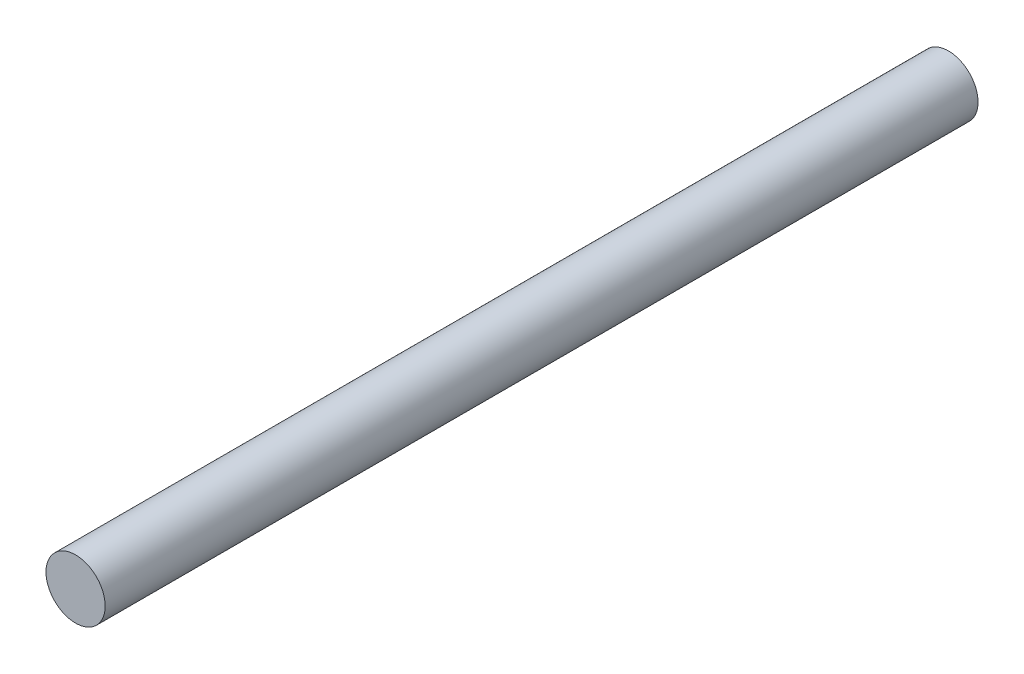
ISO-10303-21;
HEADER;
FILE_DESCRIPTION(('STEP AP214'),'2;1');
FILE_NAME('part.step','',(''),(''),'','','');
FILE_SCHEMA(('AUTOMOTIVE_DESIGN { 1 0 10303 214 1 1 1 1 }'));
ENDSEC;
DATA;
#1=APPLICATION_CONTEXT('core data for automotive mechanical design processes');
#2=APPLICATION_PROTOCOL_DEFINITION('international standard','automotive_design',2000,#1);
#3=PRODUCT_CONTEXT('',#1,'mechanical');
#4=PRODUCT('Part','Part','',(#3));
#5=PRODUCT_RELATED_PRODUCT_CATEGORY('part','',(#4));
#6=PRODUCT_DEFINITION_FORMATION('','',#4);
#7=PRODUCT_DEFINITION_CONTEXT('part definition',#1,'design');
#8=PRODUCT_DEFINITION('design','',#6,#7);
#9=PRODUCT_DEFINITION_SHAPE('','',#8);
#10=(LENGTH_UNIT() NAMED_UNIT(*) SI_UNIT(.MILLI.,.METRE.));
#11=(NAMED_UNIT(*) PLANE_ANGLE_UNIT() SI_UNIT($,.RADIAN.));
#12=(NAMED_UNIT(*) SI_UNIT($,.STERADIAN.) SOLID_ANGLE_UNIT());
#13=UNCERTAINTY_MEASURE_WITH_UNIT(LENGTH_MEASURE(1.E-05),#10,'distance_accuracy_value','');
#14=(GEOMETRIC_REPRESENTATION_CONTEXT(3) GLOBAL_UNCERTAINTY_ASSIGNED_CONTEXT((#13)) GLOBAL_UNIT_ASSIGNED_CONTEXT((#10,
#11,#12)) REPRESENTATION_CONTEXT('',''));
#15=CARTESIAN_POINT('',(0.,0.,0.));
#16=DIRECTION('',(0.,0.,1.));
#17=DIRECTION('',(1.,0.,0.));
#18=AXIS2_PLACEMENT_3D('',#15,#16,#17);
#19=CARTESIAN_POINT('',(-25.2692554848573,4.15645087916714,59.));
#20=DIRECTION('',(0.,0.,-1.));
#21=DIRECTION('',(-1.,0.,0.));
#22=AXIS2_PLACEMENT_3D('',#19,#20,#21);
#23=CYLINDRICAL_SURFACE('',#22,2.);
#24=CARTESIAN_POINT('',(-25.2692554848573,4.15645087916714,59.));
#25=DIRECTION('',(0.,0.,1.));
#26=DIRECTION('',(1.,0.,0.));
#27=AXIS2_PLACEMENT_3D('',#24,#25,#26);
#28=CIRCLE('',#27,2.);
#29=CARTESIAN_POINT('',(-27.2692554848573,4.15645087916714,59.));
#30=VERTEX_POINT('',#29);
#31=EDGE_CURVE('E10',#30,#30,#28,.T.);
#32=CARTESIAN_POINT('',(-25.2692554848573,4.15645087916714,0.));
#33=DIRECTION('',(0.,0.,1.));
#34=DIRECTION('',(1.,0.,0.));
#35=AXIS2_PLACEMENT_3D('',#32,#33,#34);
#36=CIRCLE('',#35,2.);
#37=CARTESIAN_POINT('',(-27.2692554848573,4.15645087916714,0.));
#38=VERTEX_POINT('',#37);
#39=EDGE_CURVE('E34',#38,#38,#36,.T.);
#40=CARTESIAN_POINT('',(-27.2692554848573,4.15645087916714,59.));
#41=CARTESIAN_POINT('',(-27.2692554848573,4.15645087916714,58.3854166666667));
#42=CARTESIAN_POINT('',(-27.2692554848573,4.15645087916714,57.7708333333333));
#43=CARTESIAN_POINT('',(-27.2692554848573,4.15645087916714,56.5416666666667));
#44=CARTESIAN_POINT('',(-27.2692554848573,4.15645087916714,55.9270833333333));
#45=CARTESIAN_POINT('',(-27.2692554848573,4.15645087916714,54.6979166666667));
#46=CARTESIAN_POINT('',(-27.2692554848573,4.15645087916714,54.0833333333333));
#47=CARTESIAN_POINT('',(-27.2692554848573,4.15645087916714,52.8541666666667));
#48=CARTESIAN_POINT('',(-27.2692554848573,4.15645087916714,52.2395833333333));
#49=CARTESIAN_POINT('',(-27.2692554848573,4.15645087916714,51.0104166666667));
#50=CARTESIAN_POINT('',(-27.2692554848573,4.15645087916714,50.3958333333333));
#51=CARTESIAN_POINT('',(-27.2692554848573,4.15645087916714,49.1666666666667));
#52=CARTESIAN_POINT('',(-27.2692554848573,4.15645087916714,48.5520833333333));
#53=CARTESIAN_POINT('',(-27.2692554848573,4.15645087916714,47.3229166666667));
#54=CARTESIAN_POINT('',(-27.2692554848573,4.15645087916714,46.7083333333333));
#55=CARTESIAN_POINT('',(-27.2692554848573,4.15645087916714,45.4791666666667));
#56=CARTESIAN_POINT('',(-27.2692554848573,4.15645087916714,44.8645833333333));
#57=CARTESIAN_POINT('',(-27.2692554848573,4.15645087916714,43.6354166666667));
#58=CARTESIAN_POINT('',(-27.2692554848573,4.15645087916714,43.0208333333333));
#59=CARTESIAN_POINT('',(-27.2692554848573,4.15645087916714,41.7916666666667));
#60=CARTESIAN_POINT('',(-27.2692554848573,4.15645087916714,41.1770833333333));
#61=CARTESIAN_POINT('',(-27.2692554848573,4.15645087916714,39.9479166666667));
#62=CARTESIAN_POINT('',(-27.2692554848573,4.15645087916714,39.3333333333333));
#63=CARTESIAN_POINT('',(-27.2692554848573,4.15645087916714,38.1041666666667));
#64=CARTESIAN_POINT('',(-27.2692554848573,4.15645087916714,37.4895833333333));
#65=CARTESIAN_POINT('',(-27.2692554848573,4.15645087916714,36.2604166666667));
#66=CARTESIAN_POINT('',(-27.2692554848573,4.15645087916714,35.6458333333333));
#67=CARTESIAN_POINT('',(-27.2692554848573,4.15645087916714,34.4166666666667));
#68=CARTESIAN_POINT('',(-27.2692554848573,4.15645087916714,33.8020833333333));
#69=CARTESIAN_POINT('',(-27.2692554848573,4.15645087916714,32.5729166666667));
#70=CARTESIAN_POINT('',(-27.2692554848573,4.15645087916714,31.9583333333333));
#71=CARTESIAN_POINT('',(-27.2692554848573,4.15645087916714,30.7291666666667));
#72=CARTESIAN_POINT('',(-27.2692554848573,4.15645087916714,30.1145833333333));
#73=CARTESIAN_POINT('',(-27.2692554848573,4.15645087916714,28.8854166666667));
#74=CARTESIAN_POINT('',(-27.2692554848573,4.15645087916714,28.2708333333333));
#75=CARTESIAN_POINT('',(-27.2692554848573,4.15645087916714,27.0416666666667));
#76=CARTESIAN_POINT('',(-27.2692554848573,4.15645087916714,26.4270833333333));
#77=CARTESIAN_POINT('',(-27.2692554848573,4.15645087916714,25.1979166666667));
#78=CARTESIAN_POINT('',(-27.2692554848573,4.15645087916714,24.5833333333333));
#79=CARTESIAN_POINT('',(-27.2692554848573,4.15645087916714,23.3541666666667));
#80=CARTESIAN_POINT('',(-27.2692554848573,4.15645087916714,22.7395833333333));
#81=CARTESIAN_POINT('',(-27.2692554848573,4.15645087916714,21.5104166666667));
#82=CARTESIAN_POINT('',(-27.2692554848573,4.15645087916714,20.8958333333333));
#83=CARTESIAN_POINT('',(-27.2692554848573,4.15645087916714,19.6666666666667));
#84=CARTESIAN_POINT('',(-27.2692554848573,4.15645087916714,19.0520833333333));
#85=CARTESIAN_POINT('',(-27.2692554848573,4.15645087916714,17.8229166666667));
#86=CARTESIAN_POINT('',(-27.2692554848573,4.15645087916714,17.2083333333333));
#87=CARTESIAN_POINT('',(-27.2692554848573,4.15645087916714,15.9791666666667));
#88=CARTESIAN_POINT('',(-27.2692554848573,4.15645087916714,15.3645833333333));
#89=CARTESIAN_POINT('',(-27.2692554848573,4.15645087916714,14.1354166666667));
#90=CARTESIAN_POINT('',(-27.2692554848573,4.15645087916714,13.5208333333333));
#91=CARTESIAN_POINT('',(-27.2692554848573,4.15645087916714,12.2916666666667));
#92=CARTESIAN_POINT('',(-27.2692554848573,4.15645087916714,11.6770833333333));
#93=CARTESIAN_POINT('',(-27.2692554848573,4.15645087916714,10.4479166666667));
#94=CARTESIAN_POINT('',(-27.2692554848573,4.15645087916714,9.83333333333334));
#95=CARTESIAN_POINT('',(-27.2692554848573,4.15645087916714,8.60416666666667));
#96=CARTESIAN_POINT('',(-27.2692554848573,4.15645087916714,7.98958333333333));
#97=CARTESIAN_POINT('',(-27.2692554848573,4.15645087916714,6.76041666666667));
#98=CARTESIAN_POINT('',(-27.2692554848573,4.15645087916714,6.14583333333333));
#99=CARTESIAN_POINT('',(-27.2692554848573,4.15645087916714,4.91666666666667));
#100=CARTESIAN_POINT('',(-27.2692554848573,4.15645087916714,4.30208333333334));
#101=CARTESIAN_POINT('',(-27.2692554848573,4.15645087916714,3.07291666666667));
#102=CARTESIAN_POINT('',(-27.2692554848573,4.15645087916714,2.45833333333333));
#103=CARTESIAN_POINT('',(-27.2692554848573,4.15645087916714,1.22916666666667));
#104=CARTESIAN_POINT('',(-27.2692554848573,4.15645087916714,0.614583333333332));
#105=CARTESIAN_POINT('',(-27.2692554848573,4.15645087916714,0.));
#106=B_SPLINE_CURVE_WITH_KNOTS('',3,(#40,#41,#42,#43,#44,#45,#46,#47,#48,#49,#50,#51,#52,#53,
#54,#55,#56,#57,#58,#59,#60,#61,#62,#63,#64,#65,#66,#67,#68,#69,#70,#71,#72,#73,#74,#75,#76,#77,
#78,#79,#80,#81,#82,#83,#84,#85,#86,#87,#88,#89,#90,#91,#92,#93,#94,#95,#96,#97,#98,#99,#100,
#101,#102,#103,#104,#105),.UNSPECIFIED.,.F.,.F.,(4,2,2,2,2,2,2,2,2,2,2,2,2,2,2,2,2,2,2,2,2,2,2,
2,2,2,2,2,2,2,2,2,4),(0.,1.84375,3.6875,5.53124999999999,7.375,9.21875,11.0625,12.90625,14.75,
16.59375,18.4375,20.28125,22.125,23.96875,25.8125,27.65625,29.5,31.34375,33.1875,35.03125,
36.875,38.71875,40.5625,42.40625,44.25,46.09375,47.9375,49.78125,51.625,53.46875,55.3125,
57.15625,59.),.UNSPECIFIED.);
#107=EDGE_CURVE('BSEAM31',#30,#38,#106,.T.);
#108=ORIENTED_EDGE('',*,*,#31,.F.);
#109=ORIENTED_EDGE('',*,*,#39,.T.);
#110=ORIENTED_EDGE('',*,*,#107,.T.);
#111=ORIENTED_EDGE('',*,*,#107,.F.);
#112=EDGE_LOOP('',(#108,#110,#109,#111));
#113=FACE_BOUND('',#112,.T.);
#114=ADVANCED_FACE('F31',(#113),#23,.T.);
#115=CARTESIAN_POINT('',(-25.2692554848573,4.15645087916714,59.));
#116=DIRECTION('',(0.,0.,1.));
#117=DIRECTION('',(1.,0.,0.));
#118=AXIS2_PLACEMENT_3D('',#115,#116,#117);
#119=PLANE('',#118);
#120=ORIENTED_EDGE('',*,*,#31,.T.);
#121=EDGE_LOOP('',(#120));
#122=FACE_BOUND('',#121,.T.);
#123=ADVANCED_FACE('F46',(#122),#119,.T.);
#124=CARTESIAN_POINT('',(-25.2692554848573,4.15645087916714,0.));
#125=DIRECTION('',(0.,0.,1.));
#126=DIRECTION('',(1.,0.,0.));
#127=AXIS2_PLACEMENT_3D('',#124,#125,#126);
#128=PLANE('',#127);
#129=ORIENTED_EDGE('',*,*,#39,.F.);
#130=EDGE_LOOP('',(#129));
#131=FACE_BOUND('',#130,.T.);
#132=ADVANCED_FACE('F44',(#131),#128,.F.);
#133=CLOSED_SHELL('',(#114,#123,#132));
#134=MANIFOLD_SOLID_BREP('B2',#133);
#135=ADVANCED_BREP_SHAPE_REPRESENTATION('',(#18,#134),#14);
#136=SHAPE_DEFINITION_REPRESENTATION(#9,#135);
ENDSEC;
END-ISO-10303-21;
